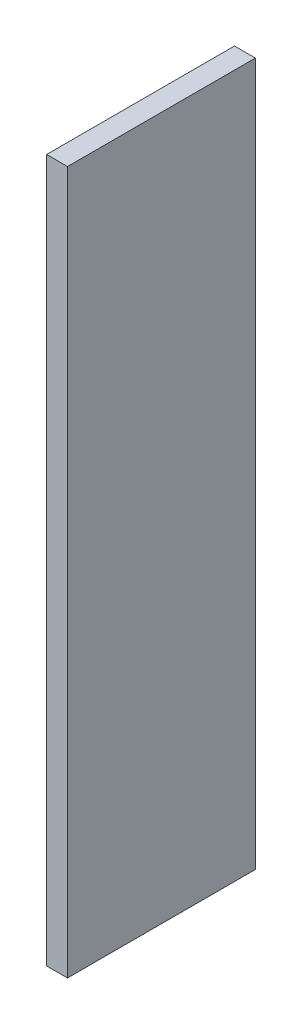
ISO-10303-21;
HEADER;
FILE_DESCRIPTION(('STEP AP214'),'2;1');
FILE_NAME('part.step','',(''),(''),'','','');
FILE_SCHEMA(('AUTOMOTIVE_DESIGN { 1 0 10303 214 1 1 1 1 }'));
ENDSEC;
DATA;
#1=APPLICATION_CONTEXT('core data for automotive mechanical design processes');
#2=APPLICATION_PROTOCOL_DEFINITION('international standard','automotive_design',2000,#1);
#3=PRODUCT_CONTEXT('',#1,'mechanical');
#4=PRODUCT('Part','Part','',(#3));
#5=PRODUCT_RELATED_PRODUCT_CATEGORY('part','',(#4));
#6=PRODUCT_DEFINITION_FORMATION('','',#4);
#7=PRODUCT_DEFINITION_CONTEXT('part definition',#1,'design');
#8=PRODUCT_DEFINITION('design','',#6,#7);
#9=PRODUCT_DEFINITION_SHAPE('','',#8);
#10=(LENGTH_UNIT() NAMED_UNIT(*) SI_UNIT(.MILLI.,.METRE.));
#11=(NAMED_UNIT(*) PLANE_ANGLE_UNIT() SI_UNIT($,.RADIAN.));
#12=(NAMED_UNIT(*) SI_UNIT($,.STERADIAN.) SOLID_ANGLE_UNIT());
#13=UNCERTAINTY_MEASURE_WITH_UNIT(LENGTH_MEASURE(1.E-05),#10,'distance_accuracy_value','');
#14=(GEOMETRIC_REPRESENTATION_CONTEXT(3) GLOBAL_UNCERTAINTY_ASSIGNED_CONTEXT((#13)) GLOBAL_UNIT_ASSIGNED_CONTEXT((#10,
#11,#12)) REPRESENTATION_CONTEXT('',''));
#15=CARTESIAN_POINT('',(0.,0.,0.));
#16=DIRECTION('',(0.,0.,1.));
#17=DIRECTION('',(1.,0.,0.));
#18=AXIS2_PLACEMENT_3D('',#15,#16,#17);
#19=CARTESIAN_POINT('',(11.894999617764,11.244998251885,0.));
#20=DIRECTION('',(0.,1.,0.));
#21=DIRECTION('',(1.,0.,0.));
#22=AXIS2_PLACEMENT_3D('',#19,#20,#21);
#23=PLANE('',#22);
#24=DIRECTION('',(0.,0.,1.));
#25=VECTOR('',#24,1.);
#26=CARTESIAN_POINT('',(11.894999617764,11.244998251885,0.));
#27=LINE('',#26,#25);
#28=CARTESIAN_POINT('',(11.894999617764,11.244998251885,0.));
#29=VERTEX_POINT('',#28);
#30=CARTESIAN_POINT('',(11.894999617764,11.244998251885,2.69999968));
#31=VERTEX_POINT('',#30);
#32=EDGE_CURVE('E11',#29,#31,#27,.T.);
#33=ORIENTED_EDGE('',*,*,#32,.T.);
#34=DIRECTION('',(1.,0.,0.));
#35=VECTOR('',#34,1.);
#36=CARTESIAN_POINT('',(11.894999617764,11.244998251885,2.69999968));
#37=LINE('',#36,#35);
#38=CARTESIAN_POINT('',(12.194999017764,11.244998251885,2.69999968));
#39=VERTEX_POINT('',#38);
#40=EDGE_CURVE('E25',#31,#39,#37,.T.);
#41=ORIENTED_EDGE('',*,*,#40,.T.);
#42=DIRECTION('',(0.,0.,1.));
#43=VECTOR('',#42,1.);
#44=CARTESIAN_POINT('',(12.194999017764,11.244998251885,0.));
#45=LINE('',#44,#43);
#46=CARTESIAN_POINT('',(12.194999017764,11.244998251885,0.));
#47=VERTEX_POINT('',#46);
#48=EDGE_CURVE('E105',#47,#39,#45,.T.);
#49=ORIENTED_EDGE('',*,*,#48,.F.);
#50=DIRECTION('',(1.,0.,0.));
#51=VECTOR('',#50,1.);
#52=CARTESIAN_POINT('',(11.894999617764,11.244998251885,0.));
#53=LINE('',#52,#51);
#54=EDGE_CURVE('E102',#29,#47,#53,.T.);
#55=ORIENTED_EDGE('',*,*,#54,.F.);
#56=EDGE_LOOP('',(#33,#41,#49,#55));
#57=FACE_BOUND('',#56,.T.);
#58=ADVANCED_FACE('F17',(#57),#23,.T.);
#59=CARTESIAN_POINT('',(12.194999017764,11.244998251885,0.));
#60=DIRECTION('',(1.,0.,0.));
#61=DIRECTION('',(0.,1.,0.));
#62=AXIS2_PLACEMENT_3D('',#59,#60,#61);
#63=PLANE('',#62);
#64=ORIENTED_EDGE('',*,*,#48,.T.);
#65=DIRECTION('',(0.,-1.,0.));
#66=VECTOR('',#65,1.);
#67=CARTESIAN_POINT('',(12.194999017764,11.244998251885,2.69999968));
#68=LINE('',#67,#66);
#69=CARTESIAN_POINT('',(12.194999017764,1.144998131885,2.69999968));
#70=VERTEX_POINT('',#69);
#71=EDGE_CURVE('E99',#39,#70,#68,.T.);
#72=ORIENTED_EDGE('',*,*,#71,.T.);
#73=DIRECTION('',(0.,0.,1.));
#74=VECTOR('',#73,1.);
#75=CARTESIAN_POINT('',(12.194999017764,1.144998131885,0.));
#76=LINE('',#75,#74);
#77=CARTESIAN_POINT('',(12.194999017764,1.144998131885,0.));
#78=VERTEX_POINT('',#77);
#79=EDGE_CURVE('E96',#78,#70,#76,.T.);
#80=ORIENTED_EDGE('',*,*,#79,.F.);
#81=DIRECTION('',(0.,-1.,0.));
#82=VECTOR('',#81,1.);
#83=CARTESIAN_POINT('',(12.194999017764,11.244998251885,0.));
#84=LINE('',#83,#82);
#85=EDGE_CURVE('E81',#47,#78,#84,.T.);
#86=ORIENTED_EDGE('',*,*,#85,.F.);
#87=EDGE_LOOP('',(#64,#72,#80,#86));
#88=FACE_BOUND('',#87,.T.);
#89=ADVANCED_FACE('F112',(#88),#63,.T.);
#90=CARTESIAN_POINT('',(12.194999017764,1.144998131885,0.));
#91=DIRECTION('',(0.,-1.,0.));
#92=DIRECTION('',(0.,0.,-1.));
#93=AXIS2_PLACEMENT_3D('',#90,#91,#92);
#94=PLANE('',#93);
#95=ORIENTED_EDGE('',*,*,#79,.T.);
#96=DIRECTION('',(-1.,0.,0.));
#97=VECTOR('',#96,1.);
#98=CARTESIAN_POINT('',(12.194999017764,1.144998131885,2.69999968));
#99=LINE('',#98,#97);
#100=CARTESIAN_POINT('',(11.894999617764,1.144998131885,2.69999968));
#101=VERTEX_POINT('',#100);
#102=EDGE_CURVE('E70',#70,#101,#99,.T.);
#103=ORIENTED_EDGE('',*,*,#102,.T.);
#104=DIRECTION('',(0.,0.,1.));
#105=VECTOR('',#104,1.);
#106=CARTESIAN_POINT('',(11.894999617764,1.144998131885,0.));
#107=LINE('',#106,#105);
#108=CARTESIAN_POINT('',(11.894999617764,1.144998131885,0.));
#109=VERTEX_POINT('',#108);
#110=EDGE_CURVE('E64',#109,#101,#107,.T.);
#111=ORIENTED_EDGE('',*,*,#110,.F.);
#112=DIRECTION('',(-1.,0.,0.));
#113=VECTOR('',#112,1.);
#114=CARTESIAN_POINT('',(12.194999017764,1.144998131885,0.));
#115=LINE('',#114,#113);
#116=EDGE_CURVE('E68',#78,#109,#115,.T.);
#117=ORIENTED_EDGE('',*,*,#116,.F.);
#118=EDGE_LOOP('',(#95,#103,#111,#117));
#119=FACE_BOUND('',#118,.T.);
#120=ADVANCED_FACE('F67',(#119),#94,.T.);
#121=CARTESIAN_POINT('',(11.894999617764,1.144998131885,0.));
#122=DIRECTION('',(-1.,0.,0.));
#123=DIRECTION('',(0.,0.,1.));
#124=AXIS2_PLACEMENT_3D('',#121,#122,#123);
#125=PLANE('',#124);
#126=ORIENTED_EDGE('',*,*,#110,.T.);
#127=DIRECTION('',(0.,1.,0.));
#128=VECTOR('',#127,1.);
#129=CARTESIAN_POINT('',(11.894999617764,1.144998131885,2.69999968));
#130=LINE('',#129,#128);
#131=EDGE_CURVE('E83',#101,#31,#130,.T.);
#132=ORIENTED_EDGE('',*,*,#131,.T.);
#133=ORIENTED_EDGE('',*,*,#32,.F.);
#134=DIRECTION('',(0.,1.,0.));
#135=VECTOR('',#134,1.);
#136=CARTESIAN_POINT('',(11.894999617764,1.144998131885,0.));
#137=LINE('',#136,#135);
#138=EDGE_CURVE('E79',#109,#29,#137,.T.);
#139=ORIENTED_EDGE('',*,*,#138,.F.);
#140=EDGE_LOOP('',(#126,#132,#133,#139));
#141=FACE_BOUND('',#140,.T.);
#142=ADVANCED_FACE('F85',(#141),#125,.T.);
#143=CARTESIAN_POINT('',(11.894999617764,11.244998251885,0.));
#144=DIRECTION('',(0.,0.,1.));
#145=DIRECTION('',(1.,0.,0.));
#146=AXIS2_PLACEMENT_3D('',#143,#144,#145);
#147=PLANE('',#146);
#148=ORIENTED_EDGE('',*,*,#54,.T.);
#149=ORIENTED_EDGE('',*,*,#85,.T.);
#150=ORIENTED_EDGE('',*,*,#116,.T.);
#151=ORIENTED_EDGE('',*,*,#138,.T.);
#152=EDGE_LOOP('',(#148,#149,#150,#151));
#153=FACE_BOUND('',#152,.T.);
#154=ADVANCED_FACE('F78',(#153),#147,.F.);
#155=CARTESIAN_POINT('',(11.894999617764,11.244998251885,2.69999968));
#156=DIRECTION('',(0.,0.,1.));
#157=DIRECTION('',(1.,0.,0.));
#158=AXIS2_PLACEMENT_3D('',#155,#156,#157);
#159=PLANE('',#158);
#160=ORIENTED_EDGE('',*,*,#131,.F.);
#161=ORIENTED_EDGE('',*,*,#102,.F.);
#162=ORIENTED_EDGE('',*,*,#71,.F.);
#163=ORIENTED_EDGE('',*,*,#40,.F.);
#164=EDGE_LOOP('',(#160,#161,#162,#163));
#165=FACE_BOUND('',#164,.T.);
#166=ADVANCED_FACE('F113',(#165),#159,.T.);
#167=CLOSED_SHELL('',(#58,#89,#120,#142,#154,#166));
#168=MANIFOLD_SOLID_BREP('B1',#167);
#169=ADVANCED_BREP_SHAPE_REPRESENTATION('',(#18,#168),#14);
#170=SHAPE_DEFINITION_REPRESENTATION(#9,#169);
ENDSEC;
END-ISO-10303-21;
